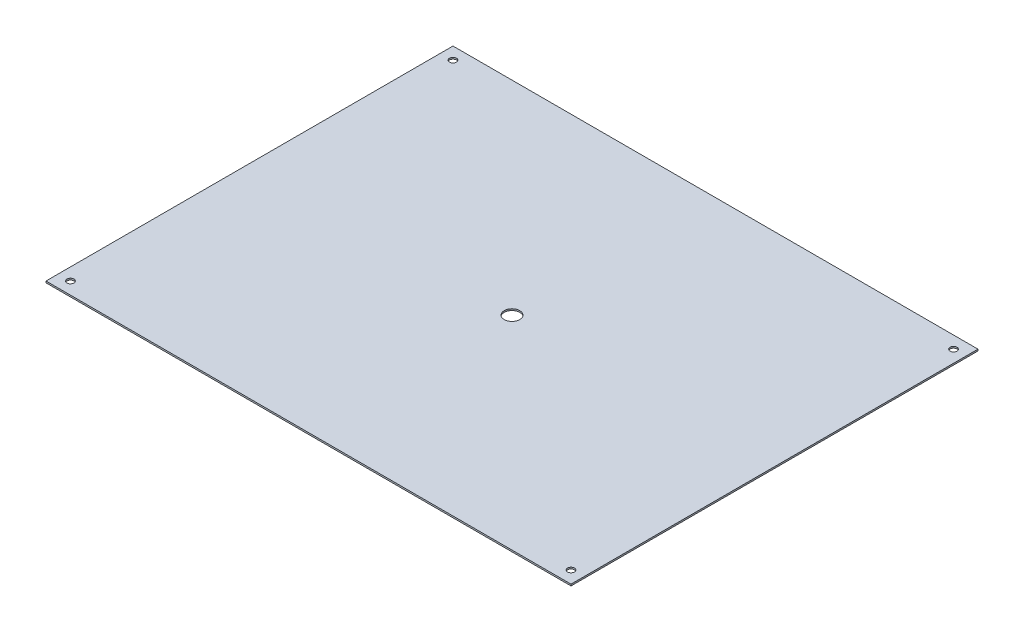
ISO-10303-21;
HEADER;
FILE_DESCRIPTION(('STEP AP214'),'2;1');
FILE_NAME('part.step','',(''),(''),'','','');
FILE_SCHEMA(('AUTOMOTIVE_DESIGN { 1 0 10303 214 1 1 1 1 }'));
ENDSEC;
DATA;
#1=APPLICATION_CONTEXT('core data for automotive mechanical design processes');
#2=APPLICATION_PROTOCOL_DEFINITION('international standard','automotive_design',2000,#1);
#3=PRODUCT_CONTEXT('',#1,'mechanical');
#4=PRODUCT('Part','Part','',(#3));
#5=PRODUCT_RELATED_PRODUCT_CATEGORY('part','',(#4));
#6=PRODUCT_DEFINITION_FORMATION('','',#4);
#7=PRODUCT_DEFINITION_CONTEXT('part definition',#1,'design');
#8=PRODUCT_DEFINITION('design','',#6,#7);
#9=PRODUCT_DEFINITION_SHAPE('','',#8);
#10=(LENGTH_UNIT() NAMED_UNIT(*) SI_UNIT(.MILLI.,.METRE.));
#11=(NAMED_UNIT(*) PLANE_ANGLE_UNIT() SI_UNIT($,.RADIAN.));
#12=(NAMED_UNIT(*) SI_UNIT($,.STERADIAN.) SOLID_ANGLE_UNIT());
#13=UNCERTAINTY_MEASURE_WITH_UNIT(LENGTH_MEASURE(1.E-05),#10,'distance_accuracy_value','');
#14=(GEOMETRIC_REPRESENTATION_CONTEXT(3) GLOBAL_UNCERTAINTY_ASSIGNED_CONTEXT((#13)) GLOBAL_UNIT_ASSIGNED_CONTEXT((#10,
#11,#12)) REPRESENTATION_CONTEXT('',''));
#15=CARTESIAN_POINT('',(0.,0.,0.));
#16=DIRECTION('',(0.,0.,1.));
#17=DIRECTION('',(1.,0.,0.));
#18=AXIS2_PLACEMENT_3D('',#15,#16,#17);
#19=CARTESIAN_POINT('',(152.4,0.396875,152.4));
#20=DIRECTION('',(0.,-1.,0.));
#21=DIRECTION('',(0.,0.,-1.));
#22=AXIS2_PLACEMENT_3D('',#19,#20,#21);
#23=PLANE('',#22);
#24=CARTESIAN_POINT('',(0.,0.396875,0.));
#25=DIRECTION('',(0.,1.,0.));
#26=DIRECTION('',(0.,0.,1.));
#27=AXIS2_PLACEMENT_3D('',#24,#25,#26);
#28=CIRCLE('',#27,3.81);
#29=CARTESIAN_POINT('',(0.,0.396875,3.81));
#30=VERTEX_POINT('',#29);
#31=EDGE_CURVE('E164',#30,#30,#28,.T.);
#32=ORIENTED_EDGE('',*,*,#31,.F.);
#33=EDGE_LOOP('',(#32));
#34=FACE_BOUND('',#33,.T.);
#35=CARTESIAN_POINT('',(123.,0.396875,-93.9999999999999));
#36=DIRECTION('',(0.,1.,0.));
#37=DIRECTION('',(0.,0.,1.));
#38=AXIS2_PLACEMENT_3D('',#35,#36,#37);
#39=CIRCLE('',#38,1.69999999999999);
#40=CARTESIAN_POINT('',(123.,0.396875,-92.2999999999999));
#41=VERTEX_POINT('',#40);
#42=EDGE_CURVE('E148',#41,#41,#39,.T.);
#43=ORIENTED_EDGE('',*,*,#42,.F.);
#44=EDGE_LOOP('',(#43));
#45=FACE_BOUND('',#44,.T.);
#46=CARTESIAN_POINT('',(122.999999999999,0.396875,94.0000000000001));
#47=DIRECTION('',(0.,1.,0.));
#48=DIRECTION('',(0.,0.,1.));
#49=AXIS2_PLACEMENT_3D('',#46,#47,#48);
#50=CIRCLE('',#49,1.69999999999999);
#51=CARTESIAN_POINT('',(122.999999999999,0.396875,95.7000000000001));
#52=VERTEX_POINT('',#51);
#53=EDGE_CURVE('E140',#52,#52,#50,.T.);
#54=ORIENTED_EDGE('',*,*,#53,.F.);
#55=EDGE_LOOP('',(#54));
#56=FACE_BOUND('',#55,.T.);
#57=CARTESIAN_POINT('',(-122.975,0.396875,94.0000000000001));
#58=DIRECTION('',(0.,1.,0.));
#59=DIRECTION('',(0.,0.,1.));
#60=AXIS2_PLACEMENT_3D('',#57,#58,#59);
#61=CIRCLE('',#60,1.69999999999999);
#62=CARTESIAN_POINT('',(-122.975,0.396875,95.7000000000001));
#63=VERTEX_POINT('',#62);
#64=EDGE_CURVE('E132',#63,#63,#61,.T.);
#65=ORIENTED_EDGE('',*,*,#64,.F.);
#66=EDGE_LOOP('',(#65));
#67=FACE_BOUND('',#66,.T.);
#68=DIRECTION('',(0.,0.,1.));
#69=VECTOR('',#68,1.);
#70=CARTESIAN_POINT('',(-129.,0.396875,-100.));
#71=LINE('',#70,#69);
#72=CARTESIAN_POINT('',(-129.,0.396875,-99.9999999999999));
#73=VERTEX_POINT('',#72);
#74=CARTESIAN_POINT('',(-129.,0.396875,100.));
#75=VERTEX_POINT('',#74);
#76=EDGE_CURVE('E77',#73,#75,#71,.T.);
#77=ORIENTED_EDGE('',*,*,#76,.T.);
#78=DIRECTION('',(1.,0.,0.));
#79=VECTOR('',#78,1.);
#80=CARTESIAN_POINT('',(-129.,0.396875,100.));
#81=LINE('',#80,#79);
#82=CARTESIAN_POINT('',(129.,0.396875,100.));
#83=VERTEX_POINT('',#82);
#84=EDGE_CURVE('E81',#75,#83,#81,.T.);
#85=ORIENTED_EDGE('',*,*,#84,.T.);
#86=DIRECTION('',(0.,0.,-1.));
#87=VECTOR('',#86,1.);
#88=CARTESIAN_POINT('',(129.,0.396875,-100.));
#89=LINE('',#88,#87);
#90=CARTESIAN_POINT('',(129.,0.396875,-100.));
#91=VERTEX_POINT('',#90);
#92=EDGE_CURVE('E101',#83,#91,#89,.T.);
#93=ORIENTED_EDGE('',*,*,#92,.T.);
#94=DIRECTION('',(-1.,0.,0.));
#95=VECTOR('',#94,1.);
#96=CARTESIAN_POINT('',(-129.,0.396875,-100.));
#97=LINE('',#96,#95);
#98=EDGE_CURVE('E84',#91,#73,#97,.T.);
#99=ORIENTED_EDGE('',*,*,#98,.T.);
#100=EDGE_LOOP('',(#77,#85,#93,#99));
#101=FACE_BOUND('',#100,.T.);
#102=CARTESIAN_POINT('',(-123.,0.396875,-93.9999999999999));
#103=DIRECTION('',(0.,1.,0.));
#104=DIRECTION('',(0.,0.,1.));
#105=AXIS2_PLACEMENT_3D('',#102,#103,#104);
#106=CIRCLE('',#105,1.69999999999999);
#107=CARTESIAN_POINT('',(-123.,0.396875,-92.2999999999999));
#108=VERTEX_POINT('',#107);
#109=EDGE_CURVE('E156',#108,#108,#106,.T.);
#110=ORIENTED_EDGE('',*,*,#109,.F.);
#111=EDGE_LOOP('',(#110));
#112=FACE_BOUND('',#111,.T.);
#113=ADVANCED_FACE('F39',(#34,#45,#56,#67,#101,#112),#23,.F.);
#114=CARTESIAN_POINT('',(-129.,-0.397875,-100.));
#115=DIRECTION('',(-1.,0.,0.));
#116=DIRECTION('',(0.,0.,1.));
#117=AXIS2_PLACEMENT_3D('',#114,#115,#116);
#118=PLANE('',#117);
#119=DIRECTION('',(0.,0.,-1.));
#120=VECTOR('',#119,1.);
#121=CARTESIAN_POINT('',(-129.,-0.396875,-100.));
#122=LINE('',#121,#120);
#123=CARTESIAN_POINT('',(-129.,-0.396875,100.));
#124=VERTEX_POINT('',#123);
#125=CARTESIAN_POINT('',(-129.,-0.396875,-99.9999999999999));
#126=VERTEX_POINT('',#125);
#127=EDGE_CURVE('E54',#124,#126,#122,.T.);
#128=ORIENTED_EDGE('',*,*,#127,.F.);
#129=DIRECTION('',(0.,1.,0.));
#130=VECTOR('',#129,1.);
#131=CARTESIAN_POINT('',(-129.,-0.397875,100.));
#132=LINE('',#131,#130);
#133=EDGE_CURVE('E91',#124,#75,#132,.T.);
#134=ORIENTED_EDGE('',*,*,#133,.T.);
#135=ORIENTED_EDGE('',*,*,#76,.F.);
#136=DIRECTION('',(0.,1.,0.));
#137=VECTOR('',#136,1.);
#138=CARTESIAN_POINT('',(-129.,-0.397875,-100.));
#139=LINE('',#138,#137);
#140=EDGE_CURVE('E48',#126,#73,#139,.T.);
#141=ORIENTED_EDGE('',*,*,#140,.F.);
#142=EDGE_LOOP('',(#128,#134,#135,#141));
#143=FACE_BOUND('',#142,.T.);
#144=ADVANCED_FACE('F92',(#143),#118,.T.);
#145=CARTESIAN_POINT('',(-129.,-0.397875,-100.));
#146=DIRECTION('',(0.,0.,-1.));
#147=DIRECTION('',(-1.,0.,0.));
#148=AXIS2_PLACEMENT_3D('',#145,#146,#147);
#149=PLANE('',#148);
#150=DIRECTION('',(1.,0.,0.));
#151=VECTOR('',#150,1.);
#152=CARTESIAN_POINT('',(-129.,-0.396875,-100.));
#153=LINE('',#152,#151);
#154=CARTESIAN_POINT('',(129.,-0.396875,-100.));
#155=VERTEX_POINT('',#154);
#156=EDGE_CURVE('E58',#126,#155,#153,.T.);
#157=ORIENTED_EDGE('',*,*,#156,.F.);
#158=ORIENTED_EDGE('',*,*,#140,.T.);
#159=ORIENTED_EDGE('',*,*,#98,.F.);
#160=DIRECTION('',(0.,1.,0.));
#161=VECTOR('',#160,1.);
#162=CARTESIAN_POINT('',(129.,-0.397875,-100.));
#163=LINE('',#162,#161);
#164=EDGE_CURVE('E111',#155,#91,#163,.T.);
#165=ORIENTED_EDGE('',*,*,#164,.F.);
#166=EDGE_LOOP('',(#157,#158,#159,#165));
#167=FACE_BOUND('',#166,.T.);
#168=ADVANCED_FACE('F121',(#167),#149,.T.);
#169=CARTESIAN_POINT('',(129.,-0.397875,-100.));
#170=DIRECTION('',(1.,0.,0.));
#171=DIRECTION('',(0.,0.,-1.));
#172=AXIS2_PLACEMENT_3D('',#169,#170,#171);
#173=PLANE('',#172);
#174=DIRECTION('',(0.,0.,1.));
#175=VECTOR('',#174,1.);
#176=CARTESIAN_POINT('',(129.,-0.396875,-100.));
#177=LINE('',#176,#175);
#178=CARTESIAN_POINT('',(129.,-0.396875,100.));
#179=VERTEX_POINT('',#178);
#180=EDGE_CURVE('E119',#155,#179,#177,.T.);
#181=ORIENTED_EDGE('',*,*,#180,.F.);
#182=ORIENTED_EDGE('',*,*,#164,.T.);
#183=ORIENTED_EDGE('',*,*,#92,.F.);
#184=DIRECTION('',(0.,1.,0.));
#185=VECTOR('',#184,1.);
#186=CARTESIAN_POINT('',(129.,-0.397875,100.));
#187=LINE('',#186,#185);
#188=EDGE_CURVE('E96',#179,#83,#187,.T.);
#189=ORIENTED_EDGE('',*,*,#188,.F.);
#190=EDGE_LOOP('',(#181,#182,#183,#189));
#191=FACE_BOUND('',#190,.T.);
#192=ADVANCED_FACE('F118',(#191),#173,.T.);
#193=CARTESIAN_POINT('',(-129.,-0.397875,100.));
#194=DIRECTION('',(0.,0.,1.));
#195=DIRECTION('',(1.,0.,0.));
#196=AXIS2_PLACEMENT_3D('',#193,#194,#195);
#197=PLANE('',#196);
#198=DIRECTION('',(-1.,0.,0.));
#199=VECTOR('',#198,1.);
#200=CARTESIAN_POINT('',(-129.,-0.396875,100.));
#201=LINE('',#200,#199);
#202=EDGE_CURVE('E11',#179,#124,#201,.T.);
#203=ORIENTED_EDGE('',*,*,#202,.F.);
#204=ORIENTED_EDGE('',*,*,#188,.T.);
#205=ORIENTED_EDGE('',*,*,#84,.F.);
#206=ORIENTED_EDGE('',*,*,#133,.F.);
#207=EDGE_LOOP('',(#203,#204,#205,#206));
#208=FACE_BOUND('',#207,.T.);
#209=ADVANCED_FACE('F97',(#208),#197,.T.);
#210=CARTESIAN_POINT('',(152.4,-0.396875,152.4));
#211=DIRECTION('',(0.,1.,0.));
#212=DIRECTION('',(0.,0.,1.));
#213=AXIS2_PLACEMENT_3D('',#210,#211,#212);
#214=PLANE('',#213);
#215=CARTESIAN_POINT('',(0.,-0.396875,0.));
#216=DIRECTION('',(0.,1.,0.));
#217=DIRECTION('',(0.,0.,1.));
#218=AXIS2_PLACEMENT_3D('',#215,#216,#217);
#219=CIRCLE('',#218,3.81);
#220=CARTESIAN_POINT('',(0.,-0.396875,3.81));
#221=VERTEX_POINT('',#220);
#222=EDGE_CURVE('E160',#221,#221,#219,.F.);
#223=ORIENTED_EDGE('',*,*,#222,.F.);
#224=EDGE_LOOP('',(#223));
#225=FACE_BOUND('',#224,.T.);
#226=CARTESIAN_POINT('',(-123.,-0.396875,-93.9999999999999));
#227=DIRECTION('',(0.,1.,0.));
#228=DIRECTION('',(0.,0.,1.));
#229=AXIS2_PLACEMENT_3D('',#226,#227,#228);
#230=CIRCLE('',#229,1.69999999999999);
#231=CARTESIAN_POINT('',(-123.,-0.396875,-92.2999999999999));
#232=VERTEX_POINT('',#231);
#233=EDGE_CURVE('E152',#232,#232,#230,.T.);
#234=ORIENTED_EDGE('',*,*,#233,.T.);
#235=EDGE_LOOP('',(#234));
#236=FACE_BOUND('',#235,.T.);
#237=CARTESIAN_POINT('',(123.,-0.396875,-93.9999999999999));
#238=DIRECTION('',(0.,1.,0.));
#239=DIRECTION('',(0.,0.,1.));
#240=AXIS2_PLACEMENT_3D('',#237,#238,#239);
#241=CIRCLE('',#240,1.69999999999999);
#242=CARTESIAN_POINT('',(123.,-0.396875,-92.2999999999999));
#243=VERTEX_POINT('',#242);
#244=EDGE_CURVE('E144',#243,#243,#241,.T.);
#245=ORIENTED_EDGE('',*,*,#244,.T.);
#246=EDGE_LOOP('',(#245));
#247=FACE_BOUND('',#246,.T.);
#248=CARTESIAN_POINT('',(122.999999999999,-0.396875,94.0000000000001));
#249=DIRECTION('',(0.,1.,0.));
#250=DIRECTION('',(0.,0.,1.));
#251=AXIS2_PLACEMENT_3D('',#248,#249,#250);
#252=CIRCLE('',#251,1.69999999999999);
#253=CARTESIAN_POINT('',(122.999999999999,-0.396875,95.7000000000001));
#254=VERTEX_POINT('',#253);
#255=EDGE_CURVE('E136',#254,#254,#252,.T.);
#256=ORIENTED_EDGE('',*,*,#255,.T.);
#257=EDGE_LOOP('',(#256));
#258=FACE_BOUND('',#257,.T.);
#259=CARTESIAN_POINT('',(-122.975,-0.396875,94.0000000000001));
#260=DIRECTION('',(0.,1.,0.));
#261=DIRECTION('',(0.,0.,1.));
#262=AXIS2_PLACEMENT_3D('',#259,#260,#261);
#263=CIRCLE('',#262,1.69999999999999);
#264=CARTESIAN_POINT('',(-122.975,-0.396875,95.7000000000001));
#265=VERTEX_POINT('',#264);
#266=EDGE_CURVE('E126',#265,#265,#263,.T.);
#267=ORIENTED_EDGE('',*,*,#266,.T.);
#268=EDGE_LOOP('',(#267));
#269=FACE_BOUND('',#268,.T.);
#270=ORIENTED_EDGE('',*,*,#127,.T.);
#271=ORIENTED_EDGE('',*,*,#156,.T.);
#272=ORIENTED_EDGE('',*,*,#180,.T.);
#273=ORIENTED_EDGE('',*,*,#202,.T.);
#274=EDGE_LOOP('',(#270,#271,#272,#273));
#275=FACE_BOUND('',#274,.T.);
#276=ADVANCED_FACE('F41',(#225,#236,#247,#258,#269,#275),#214,.F.);
#277=CARTESIAN_POINT('',(-122.975,0.396875,94.0000000000001));
#278=DIRECTION('',(0.,1.,0.));
#279=DIRECTION('',(0.,0.,1.));
#280=AXIS2_PLACEMENT_3D('',#277,#278,#279);
#281=CYLINDRICAL_SURFACE('',#280,1.69999999999999);
#282=ORIENTED_EDGE('',*,*,#266,.F.);
#283=EDGE_LOOP('',(#282));
#284=FACE_BOUND('',#283,.T.);
#285=ORIENTED_EDGE('',*,*,#64,.T.);
#286=EDGE_LOOP('',(#285));
#287=FACE_BOUND('',#286,.T.);
#288=ADVANCED_FACE('F180',(#284,#287),#281,.F.);
#289=CARTESIAN_POINT('',(122.999999999999,0.396875,94.0000000000001));
#290=DIRECTION('',(0.,1.,0.));
#291=DIRECTION('',(0.,0.,1.));
#292=AXIS2_PLACEMENT_3D('',#289,#290,#291);
#293=CYLINDRICAL_SURFACE('',#292,1.69999999999999);
#294=ORIENTED_EDGE('',*,*,#255,.F.);
#295=EDGE_LOOP('',(#294));
#296=FACE_BOUND('',#295,.T.);
#297=ORIENTED_EDGE('',*,*,#53,.T.);
#298=EDGE_LOOP('',(#297));
#299=FACE_BOUND('',#298,.T.);
#300=ADVANCED_FACE('F182',(#296,#299),#293,.F.);
#301=CARTESIAN_POINT('',(123.,0.396875,-93.9999999999999));
#302=DIRECTION('',(0.,1.,0.));
#303=DIRECTION('',(0.,0.,1.));
#304=AXIS2_PLACEMENT_3D('',#301,#302,#303);
#305=CYLINDRICAL_SURFACE('',#304,1.69999999999999);
#306=ORIENTED_EDGE('',*,*,#244,.F.);
#307=EDGE_LOOP('',(#306));
#308=FACE_BOUND('',#307,.T.);
#309=ORIENTED_EDGE('',*,*,#42,.T.);
#310=EDGE_LOOP('',(#309));
#311=FACE_BOUND('',#310,.T.);
#312=ADVANCED_FACE('F189',(#308,#311),#305,.F.);
#313=CARTESIAN_POINT('',(-123.,0.396875,-93.9999999999999));
#314=DIRECTION('',(0.,1.,0.));
#315=DIRECTION('',(0.,0.,1.));
#316=AXIS2_PLACEMENT_3D('',#313,#314,#315);
#317=CYLINDRICAL_SURFACE('',#316,1.69999999999999);
#318=ORIENTED_EDGE('',*,*,#233,.F.);
#319=EDGE_LOOP('',(#318));
#320=FACE_BOUND('',#319,.T.);
#321=ORIENTED_EDGE('',*,*,#109,.T.);
#322=EDGE_LOOP('',(#321));
#323=FACE_BOUND('',#322,.T.);
#324=ADVANCED_FACE('F240',(#320,#323),#317,.F.);
#325=CARTESIAN_POINT('',(0.,-0.397875,0.));
#326=DIRECTION('',(0.,1.,0.));
#327=DIRECTION('',(0.,0.,1.));
#328=AXIS2_PLACEMENT_3D('',#325,#326,#327);
#329=CYLINDRICAL_SURFACE('',#328,3.81);
#330=ORIENTED_EDGE('',*,*,#31,.T.);
#331=EDGE_LOOP('',(#330));
#332=FACE_BOUND('',#331,.T.);
#333=ORIENTED_EDGE('',*,*,#222,.T.);
#334=EDGE_LOOP('',(#333));
#335=FACE_BOUND('',#334,.T.);
#336=ADVANCED_FACE('F169',(#332,#335),#329,.F.);
#337=CLOSED_SHELL('',(#113,#144,#168,#192,#209,#276,#288,#300,#312,#324,#336));
#338=MANIFOLD_SOLID_BREP('B2',#337);
#339=ADVANCED_BREP_SHAPE_REPRESENTATION('',(#18,#338),#14);
#340=SHAPE_DEFINITION_REPRESENTATION(#9,#339);
ENDSEC;
END-ISO-10303-21;
